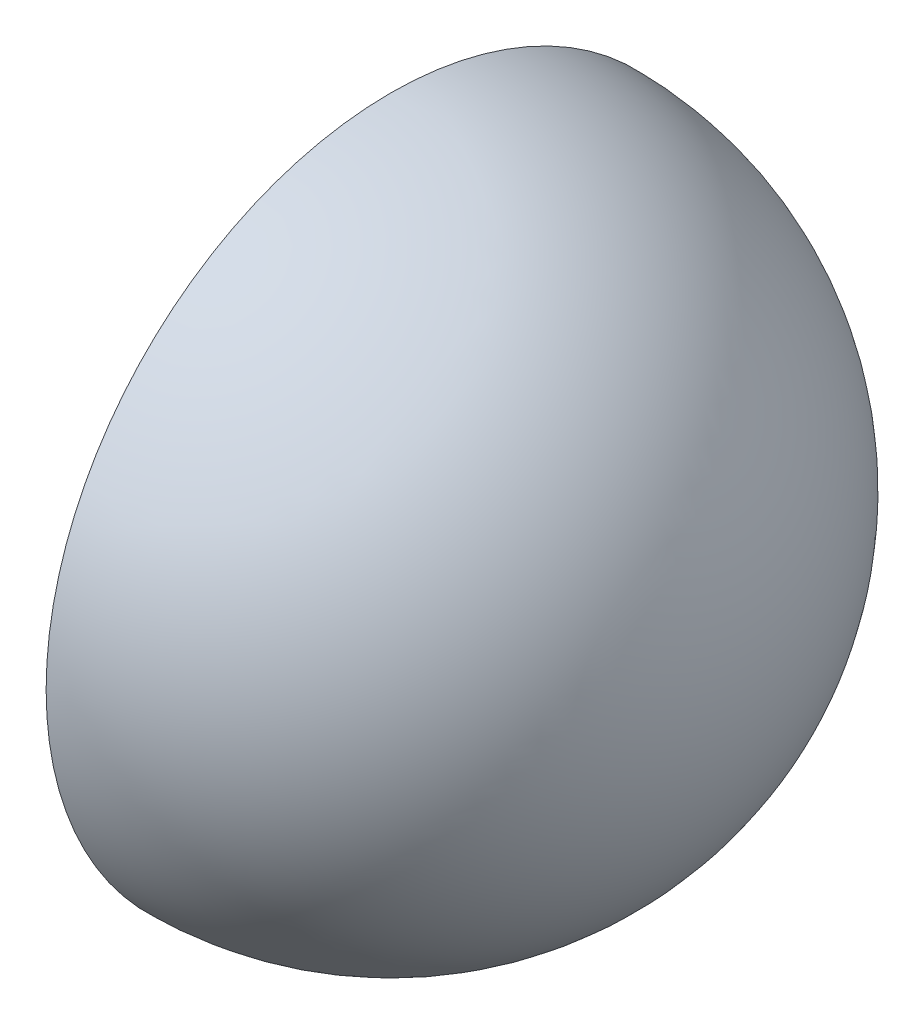
ISO-10303-21;
HEADER;
FILE_DESCRIPTION(('STEP AP214'),'2;1');
FILE_NAME('part.step','',(''),(''),'','','');
FILE_SCHEMA(('AUTOMOTIVE_DESIGN { 1 0 10303 214 1 1 1 1 }'));
ENDSEC;
DATA;
#1=APPLICATION_CONTEXT('core data for automotive mechanical design processes');
#2=APPLICATION_PROTOCOL_DEFINITION('international standard','automotive_design',2000,#1);
#3=PRODUCT_CONTEXT('',#1,'mechanical');
#4=PRODUCT('Part','Part','',(#3));
#5=PRODUCT_RELATED_PRODUCT_CATEGORY('part','',(#4));
#6=PRODUCT_DEFINITION_FORMATION('','',#4);
#7=PRODUCT_DEFINITION_CONTEXT('part definition',#1,'design');
#8=PRODUCT_DEFINITION('design','',#6,#7);
#9=PRODUCT_DEFINITION_SHAPE('','',#8);
#10=(LENGTH_UNIT() NAMED_UNIT(*) SI_UNIT(.MILLI.,.METRE.));
#11=(NAMED_UNIT(*) PLANE_ANGLE_UNIT() SI_UNIT($,.RADIAN.));
#12=(NAMED_UNIT(*) SI_UNIT($,.STERADIAN.) SOLID_ANGLE_UNIT());
#13=UNCERTAINTY_MEASURE_WITH_UNIT(LENGTH_MEASURE(1.E-05),#10,'distance_accuracy_value','');
#14=(GEOMETRIC_REPRESENTATION_CONTEXT(3) GLOBAL_UNCERTAINTY_ASSIGNED_CONTEXT((#13)) GLOBAL_UNIT_ASSIGNED_CONTEXT((#10,
#11,#12)) REPRESENTATION_CONTEXT('',''));
#15=CARTESIAN_POINT('',(0.,0.,0.));
#16=DIRECTION('',(0.,0.,1.));
#17=DIRECTION('',(1.,0.,0.));
#18=AXIS2_PLACEMENT_3D('',#15,#16,#17);
#19=CARTESIAN_POINT('',(0.,0.,0.));
#20=DIRECTION('',(-1.,0.,0.));
#21=DIRECTION('',(0.,0.,-1.));
#22=AXIS2_PLACEMENT_3D('',#19,#20,#21);
#23=SPHERICAL_SURFACE('',#22,15.);
#24=CARTESIAN_POINT('',(0.,0.,0.));
#25=DIRECTION('',(-1.,0.,0.));
#26=DIRECTION('',(0.,0.,1.));
#27=AXIS2_PLACEMENT_3D('',#24,#25,#26);
#28=CIRCLE('',#27,15.);
#29=CARTESIAN_POINT('',(0.,0.,15.));
#30=VERTEX_POINT('',#29);
#31=EDGE_CURVE('E41',#30,#30,#28,.T.);
#32=ORIENTED_EDGE('',*,*,#31,.T.);
#33=EDGE_LOOP('',(#32));
#34=FACE_BOUND('',#33,.T.);
#35=ADVANCED_FACE('F35',(#34),#23,.F.);
#36=CARTESIAN_POINT('',(0.,0.,0.));
#37=DIRECTION('',(-1.,0.,0.));
#38=DIRECTION('',(0.,0.,-1.));
#39=AXIS2_PLACEMENT_3D('',#36,#37,#38);
#40=SPHERICAL_SURFACE('',#39,17.);
#41=CARTESIAN_POINT('',(0.,0.,0.));
#42=DIRECTION('',(-1.,0.,0.));
#43=DIRECTION('',(0.,0.,1.));
#44=AXIS2_PLACEMENT_3D('',#41,#42,#43);
#45=CIRCLE('',#44,17.);
#46=CARTESIAN_POINT('',(0.,0.,17.));
#47=VERTEX_POINT('',#46);
#48=EDGE_CURVE('E10',#47,#47,#45,.T.);
#49=ORIENTED_EDGE('',*,*,#48,.F.);
#50=EDGE_LOOP('',(#49));
#51=FACE_BOUND('',#50,.T.);
#52=ADVANCED_FACE('F50',(#51),#40,.T.);
#53=CARTESIAN_POINT('',(0.,0.,-15.));
#54=DIRECTION('',(-1.,0.,0.));
#55=DIRECTION('',(0.,0.,1.));
#56=AXIS2_PLACEMENT_3D('',#53,#54,#55);
#57=PLANE('',#56);
#58=ORIENTED_EDGE('',*,*,#48,.T.);
#59=EDGE_LOOP('',(#58));
#60=FACE_BOUND('',#59,.T.);
#61=ORIENTED_EDGE('',*,*,#31,.F.);
#62=EDGE_LOOP('',(#61));
#63=FACE_BOUND('',#62,.T.);
#64=ADVANCED_FACE('F48',(#60,#63),#57,.T.);
#65=CLOSED_SHELL('',(#35,#52,#64));
#66=MANIFOLD_SOLID_BREP('B2',#65);
#67=ADVANCED_BREP_SHAPE_REPRESENTATION('',(#18,#66),#14);
#68=SHAPE_DEFINITION_REPRESENTATION(#9,#67);
ENDSEC;
END-ISO-10303-21;
